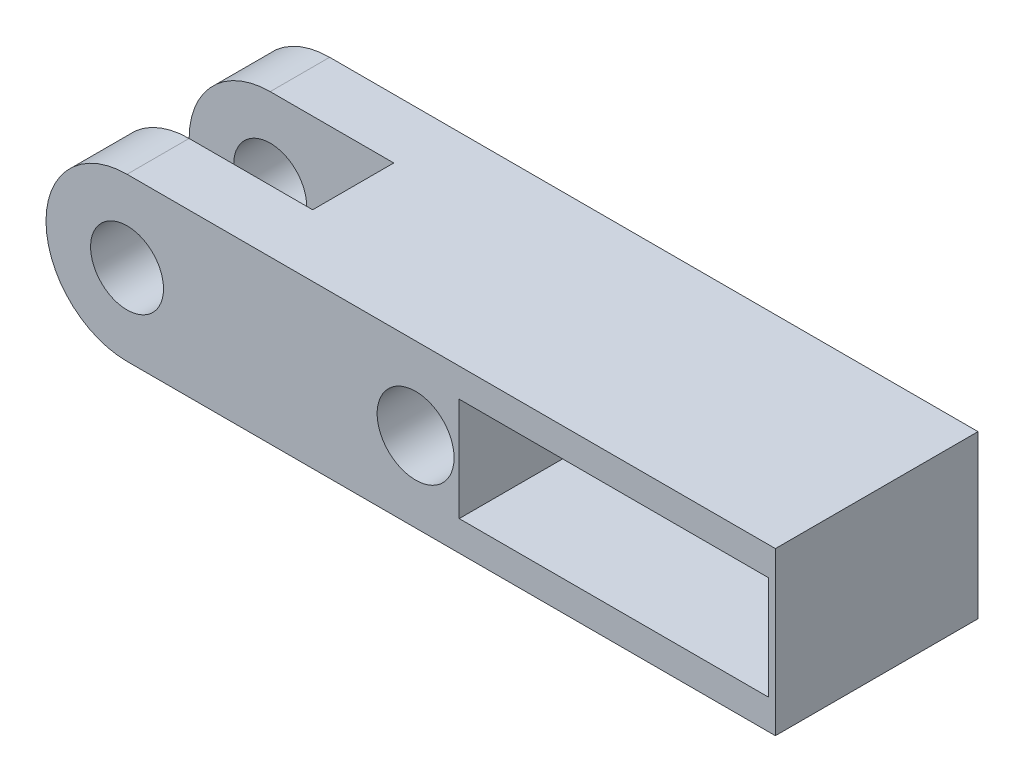
ISO-10303-21;
HEADER;
FILE_DESCRIPTION(('STEP AP214'),'2;1');
FILE_NAME('part.step','',(''),(''),'','','');
FILE_SCHEMA(('AUTOMOTIVE_DESIGN { 1 0 10303 214 1 1 1 1 }'));
ENDSEC;
DATA;
#1=APPLICATION_CONTEXT('core data for automotive mechanical design processes');
#2=APPLICATION_PROTOCOL_DEFINITION('international standard','automotive_design',2000,#1);
#3=PRODUCT_CONTEXT('',#1,'mechanical');
#4=PRODUCT('Part','Part','',(#3));
#5=PRODUCT_RELATED_PRODUCT_CATEGORY('part','',(#4));
#6=PRODUCT_DEFINITION_FORMATION('','',#4);
#7=PRODUCT_DEFINITION_CONTEXT('part definition',#1,'design');
#8=PRODUCT_DEFINITION('design','',#6,#7);
#9=PRODUCT_DEFINITION_SHAPE('','',#8);
#10=(LENGTH_UNIT() NAMED_UNIT(*) SI_UNIT(.MILLI.,.METRE.));
#11=(NAMED_UNIT(*) PLANE_ANGLE_UNIT() SI_UNIT($,.RADIAN.));
#12=(NAMED_UNIT(*) SI_UNIT($,.STERADIAN.) SOLID_ANGLE_UNIT());
#13=UNCERTAINTY_MEASURE_WITH_UNIT(LENGTH_MEASURE(1.E-05),#10,'distance_accuracy_value','');
#14=(GEOMETRIC_REPRESENTATION_CONTEXT(3) GLOBAL_UNCERTAINTY_ASSIGNED_CONTEXT((#13)) GLOBAL_UNIT_ASSIGNED_CONTEXT((#10,
#11,#12)) REPRESENTATION_CONTEXT('',''));
#15=CARTESIAN_POINT('',(0.,0.,0.));
#16=DIRECTION('',(0.,0.,1.));
#17=DIRECTION('',(1.,0.,0.));
#18=AXIS2_PLACEMENT_3D('',#15,#16,#17);
#19=CARTESIAN_POINT('',(0.,0.,6.25));
#20=DIRECTION('',(0.,0.,-1.));
#21=DIRECTION('',(-1.,0.,0.));
#22=AXIS2_PLACEMENT_3D('',#19,#20,#21);
#23=CYLINDRICAL_SURFACE('',#22,5.);
#24=DIRECTION('',(0.,0.,-1.));
#25=VECTOR('',#24,1.);
#26=CARTESIAN_POINT('',(0.,5.,6.25));
#27=LINE('',#26,#25);
#28=CARTESIAN_POINT('',(0.,5.,6.25));
#29=VERTEX_POINT('',#28);
#30=CARTESIAN_POINT('',(0.,5.,2.42259263310718));
#31=VERTEX_POINT('',#30);
#32=EDGE_CURVE('E264',#29,#31,#27,.T.);
#33=ORIENTED_EDGE('',*,*,#32,.T.);
#34=CARTESIAN_POINT('',(0.,0.,2.42259263310718));
#35=DIRECTION('',(0.,0.,1.));
#36=DIRECTION('',(1.,0.,0.));
#37=AXIS2_PLACEMENT_3D('',#34,#35,#36);
#38=CIRCLE('',#37,5.);
#39=CARTESIAN_POINT('',(0.,-5.,2.42259263310718));
#40=VERTEX_POINT('',#39);
#41=EDGE_CURVE('E170',#31,#40,#38,.T.);
#42=ORIENTED_EDGE('',*,*,#41,.T.);
#43=DIRECTION('',(0.,0.,-1.));
#44=VECTOR('',#43,1.);
#45=CARTESIAN_POINT('',(0.,-5.,6.25));
#46=LINE('',#45,#44);
#47=CARTESIAN_POINT('',(0.,-5.,6.25));
#48=VERTEX_POINT('',#47);
#49=EDGE_CURVE('E261',#48,#40,#46,.T.);
#50=ORIENTED_EDGE('',*,*,#49,.F.);
#51=CARTESIAN_POINT('',(0.,0.,6.25));
#52=DIRECTION('',(0.,0.,1.));
#53=DIRECTION('',(1.,0.,0.));
#54=AXIS2_PLACEMENT_3D('',#51,#52,#53);
#55=CIRCLE('',#54,5.);
#56=EDGE_CURVE('E203',#29,#48,#55,.T.);
#57=ORIENTED_EDGE('',*,*,#56,.F.);
#58=EDGE_LOOP('',(#33,#42,#50,#57));
#59=FACE_BOUND('',#58,.T.);
#60=ADVANCED_FACE('F49',(#59),#23,.T.);
#61=CARTESIAN_POINT('',(4.5553838479151E-12,-1.13936637902157E-10,6.25));
#62=DIRECTION('',(0.,0.,-1.));
#63=DIRECTION('',(-1.,0.,0.));
#64=AXIS2_PLACEMENT_3D('',#61,#62,#63);
#65=CYLINDRICAL_SURFACE('',#64,2.25000000000002);
#66=CARTESIAN_POINT('',(4.5553838479151E-12,-1.13936637902157E-10,2.42259263310718));
#67=DIRECTION('',(0.,0.,1.));
#68=DIRECTION('',(1.,0.,0.));
#69=AXIS2_PLACEMENT_3D('',#66,#67,#68);
#70=CIRCLE('',#69,2.25000000000002);
#71=CARTESIAN_POINT('',(2.25000000000457,-1.13936637902157E-10,2.42259263310718));
#72=VERTEX_POINT('',#71);
#73=EDGE_CURVE('E169',#72,#72,#70,.T.);
#74=ORIENTED_EDGE('',*,*,#73,.F.);
#75=EDGE_LOOP('',(#74));
#76=FACE_BOUND('',#75,.T.);
#77=CARTESIAN_POINT('',(4.5553838479151E-12,-1.13936637902157E-10,6.25));
#78=DIRECTION('',(0.,0.,1.));
#79=DIRECTION('',(1.,0.,0.));
#80=AXIS2_PLACEMENT_3D('',#77,#78,#79);
#81=CIRCLE('',#80,2.25000000000002);
#82=CARTESIAN_POINT('',(2.25000000000457,-1.13936637902157E-10,6.25));
#83=VERTEX_POINT('',#82);
#84=EDGE_CURVE('E179',#83,#83,#81,.T.);
#85=ORIENTED_EDGE('',*,*,#84,.T.);
#86=EDGE_LOOP('',(#85));
#87=FACE_BOUND('',#86,.T.);
#88=ADVANCED_FACE('F312',(#76,#87),#65,.F.);
#89=CARTESIAN_POINT('',(0.,5.,6.25));
#90=DIRECTION('',(0.,1.,0.));
#91=DIRECTION('',(0.,0.,1.));
#92=AXIS2_PLACEMENT_3D('',#89,#90,#91);
#93=PLANE('',#92);
#94=DIRECTION('',(-1.,0.,0.));
#95=VECTOR('',#94,1.);
#96=CARTESIAN_POINT('',(-5.24370745413475,5.,2.42259263310718));
#97=LINE('',#96,#95);
#98=CARTESIAN_POINT('',(7.62383381146094,5.,2.42259263310718));
#99=VERTEX_POINT('',#98);
#100=EDGE_CURVE('E156',#99,#31,#97,.T.);
#101=ORIENTED_EDGE('',*,*,#100,.T.);
#102=ORIENTED_EDGE('',*,*,#32,.F.);
#103=DIRECTION('',(1.,0.,0.));
#104=VECTOR('',#103,1.);
#105=CARTESIAN_POINT('',(0.,5.,6.25));
#106=LINE('',#105,#104);
#107=CARTESIAN_POINT('',(40.,5.,6.25));
#108=VERTEX_POINT('',#107);
#109=EDGE_CURVE('E199',#29,#108,#106,.T.);
#110=ORIENTED_EDGE('',*,*,#109,.T.);
#111=DIRECTION('',(0.,0.,-1.));
#112=VECTOR('',#111,1.);
#113=CARTESIAN_POINT('',(40.,5.,6.25));
#114=LINE('',#113,#112);
#115=CARTESIAN_POINT('',(40.,5.,-6.25));
#116=VERTEX_POINT('',#115);
#117=EDGE_CURVE('E253',#108,#116,#114,.T.);
#118=ORIENTED_EDGE('',*,*,#117,.T.);
#119=DIRECTION('',(1.,0.,0.));
#120=VECTOR('',#119,1.);
#121=CARTESIAN_POINT('',(0.,5.,-6.25));
#122=LINE('',#121,#120);
#123=CARTESIAN_POINT('',(0.,5.,-6.25));
#124=VERTEX_POINT('',#123);
#125=EDGE_CURVE('E238',#124,#116,#122,.T.);
#126=ORIENTED_EDGE('',*,*,#125,.F.);
#127=CARTESIAN_POINT('',(0.,5.,-2.58145119240226));
#128=VERTEX_POINT('',#127);
#129=EDGE_CURVE('E151',#128,#124,#27,.T.);
#130=ORIENTED_EDGE('',*,*,#129,.F.);
#131=DIRECTION('',(1.,0.,0.));
#132=VECTOR('',#131,1.);
#133=CARTESIAN_POINT('',(-5.24370745413475,5.,-2.58145119240226));
#134=LINE('',#133,#132);
#135=CARTESIAN_POINT('',(7.62383381146094,5.,-2.58145119240226));
#136=VERTEX_POINT('',#135);
#137=EDGE_CURVE('E139',#128,#136,#134,.T.);
#138=ORIENTED_EDGE('',*,*,#137,.T.);
#139=DIRECTION('',(0.,0.,1.));
#140=VECTOR('',#139,1.);
#141=CARTESIAN_POINT('',(7.62383381146094,5.,-2.58145119240226));
#142=LINE('',#141,#140);
#143=EDGE_CURVE('E149',#136,#99,#142,.T.);
#144=ORIENTED_EDGE('',*,*,#143,.T.);
#145=EDGE_LOOP('',(#101,#102,#110,#118,#126,#130,#138,#144));
#146=FACE_BOUND('',#145,.T.);
#147=ADVANCED_FACE('F148',(#146),#93,.T.);
#148=CARTESIAN_POINT('',(0.,-5.,-2.58145119240226));
#149=VERTEX_POINT('',#148);
#150=CARTESIAN_POINT('',(0.,-5.,-6.25));
#151=VERTEX_POINT('',#150);
#152=EDGE_CURVE('E260',#149,#151,#46,.T.);
#153=ORIENTED_EDGE('',*,*,#152,.F.);
#154=CARTESIAN_POINT('',(0.,0.,-2.58145119240226));
#155=DIRECTION('',(0.,0.,-1.));
#156=DIRECTION('',(-1.,0.,0.));
#157=AXIS2_PLACEMENT_3D('',#154,#155,#156);
#158=CIRCLE('',#157,5.);
#159=EDGE_CURVE('E166',#149,#128,#158,.T.);
#160=ORIENTED_EDGE('',*,*,#159,.T.);
#161=ORIENTED_EDGE('',*,*,#129,.T.);
#162=CARTESIAN_POINT('',(0.,0.,-6.25));
#163=DIRECTION('',(0.,0.,1.));
#164=DIRECTION('',(1.,0.,0.));
#165=AXIS2_PLACEMENT_3D('',#162,#163,#164);
#166=CIRCLE('',#165,5.);
#167=EDGE_CURVE('E242',#124,#151,#166,.T.);
#168=ORIENTED_EDGE('',*,*,#167,.T.);
#169=EDGE_LOOP('',(#153,#160,#161,#168));
#170=FACE_BOUND('',#169,.T.);
#171=ADVANCED_FACE('F294',(#170),#23,.T.);
#172=CARTESIAN_POINT('',(0.,-5.,6.25));
#173=DIRECTION('',(0.,1.,0.));
#174=DIRECTION('',(0.,0.,1.));
#175=AXIS2_PLACEMENT_3D('',#172,#173,#174);
#176=PLANE('',#175);
#177=DIRECTION('',(-1.,0.,0.));
#178=VECTOR('',#177,1.);
#179=CARTESIAN_POINT('',(-5.24370745413475,-5.,2.42259263310718));
#180=LINE('',#179,#178);
#181=CARTESIAN_POINT('',(17.623833811461,-5.,2.42259263310718));
#182=VERTEX_POINT('',#181);
#183=EDGE_CURVE('E66',#182,#40,#180,.T.);
#184=ORIENTED_EDGE('',*,*,#183,.F.);
#185=DIRECTION('',(0.,0.,-1.));
#186=VECTOR('',#185,1.);
#187=CARTESIAN_POINT('',(17.623833811461,-5.,6.25));
#188=LINE('',#187,#186);
#189=CARTESIAN_POINT('',(17.623833811461,-5.,-2.58145119240226));
#190=VERTEX_POINT('',#189);
#191=EDGE_CURVE('E268',#182,#190,#188,.T.);
#192=ORIENTED_EDGE('',*,*,#191,.T.);
#193=DIRECTION('',(1.,0.,0.));
#194=VECTOR('',#193,1.);
#195=CARTESIAN_POINT('',(-5.24370745413475,-5.,-2.58145119240226));
#196=LINE('',#195,#194);
#197=EDGE_CURVE('E73',#149,#190,#196,.T.);
#198=ORIENTED_EDGE('',*,*,#197,.F.);
#199=ORIENTED_EDGE('',*,*,#152,.T.);
#200=DIRECTION('',(1.,0.,0.));
#201=VECTOR('',#200,1.);
#202=CARTESIAN_POINT('',(0.,-5.,-6.25));
#203=LINE('',#202,#201);
#204=CARTESIAN_POINT('',(40.,-5.,-6.25));
#205=VERTEX_POINT('',#204);
#206=EDGE_CURVE('E246',#151,#205,#203,.T.);
#207=ORIENTED_EDGE('',*,*,#206,.T.);
#208=DIRECTION('',(0.,0.,-1.));
#209=VECTOR('',#208,1.);
#210=CARTESIAN_POINT('',(40.,-5.,6.25));
#211=LINE('',#210,#209);
#212=CARTESIAN_POINT('',(40.,-5.,6.25));
#213=VERTEX_POINT('',#212);
#214=EDGE_CURVE('E256',#213,#205,#211,.T.);
#215=ORIENTED_EDGE('',*,*,#214,.F.);
#216=DIRECTION('',(1.,0.,0.));
#217=VECTOR('',#216,1.);
#218=CARTESIAN_POINT('',(0.,-5.,6.25));
#219=LINE('',#218,#217);
#220=EDGE_CURVE('E207',#48,#213,#219,.T.);
#221=ORIENTED_EDGE('',*,*,#220,.F.);
#222=ORIENTED_EDGE('',*,*,#49,.T.);
#223=EDGE_LOOP('',(#184,#192,#198,#199,#207,#215,#221,#222));
#224=FACE_BOUND('',#223,.T.);
#225=ADVANCED_FACE('F290',(#224),#176,.F.);
#226=CARTESIAN_POINT('',(0.,3.22922335634601,6.25));
#227=DIRECTION('',(0.,1.,0.));
#228=DIRECTION('',(0.,0.,1.));
#229=AXIS2_PLACEMENT_3D('',#226,#227,#228);
#230=PLANE('',#229);
#231=DIRECTION('',(1.,0.,0.));
#232=VECTOR('',#231,1.);
#233=CARTESIAN_POINT('',(0.,3.22922335634601,-6.25));
#234=LINE('',#233,#232);
#235=CARTESIAN_POINT('',(20.493910385348,3.22922335634601,-6.25));
#236=VERTEX_POINT('',#235);
#237=CARTESIAN_POINT('',(39.573910385348,3.22922335634601,-6.25));
#238=VERTEX_POINT('',#237);
#239=EDGE_CURVE('E222',#236,#238,#234,.T.);
#240=ORIENTED_EDGE('',*,*,#239,.T.);
#241=DIRECTION('',(0.,0.,-1.));
#242=VECTOR('',#241,1.);
#243=CARTESIAN_POINT('',(39.573910385348,3.22922335634601,6.25));
#244=LINE('',#243,#242);
#245=CARTESIAN_POINT('',(39.573910385348,3.22922335634601,6.25));
#246=VERTEX_POINT('',#245);
#247=EDGE_CURVE('E257',#246,#238,#244,.T.);
#248=ORIENTED_EDGE('',*,*,#247,.F.);
#249=DIRECTION('',(1.,0.,0.));
#250=VECTOR('',#249,1.);
#251=CARTESIAN_POINT('',(0.,3.22922335634601,6.25));
#252=LINE('',#251,#250);
#253=CARTESIAN_POINT('',(20.493910385348,3.22922335634601,6.25));
#254=VERTEX_POINT('',#253);
#255=EDGE_CURVE('E184',#254,#246,#252,.T.);
#256=ORIENTED_EDGE('',*,*,#255,.F.);
#257=DIRECTION('',(0.,0.,-1.));
#258=VECTOR('',#257,1.);
#259=CARTESIAN_POINT('',(20.493910385348,3.22922335634601,6.25));
#260=LINE('',#259,#258);
#261=EDGE_CURVE('E214',#254,#236,#260,.T.);
#262=ORIENTED_EDGE('',*,*,#261,.T.);
#263=EDGE_LOOP('',(#240,#248,#256,#262));
#264=FACE_BOUND('',#263,.T.);
#265=ADVANCED_FACE('F328',(#264),#230,.F.);
#266=CARTESIAN_POINT('',(39.573910385348,0.,6.25));
#267=DIRECTION('',(1.,0.,0.));
#268=DIRECTION('',(0.,0.,-1.));
#269=AXIS2_PLACEMENT_3D('',#266,#267,#268);
#270=PLANE('',#269);
#271=DIRECTION('',(0.,-1.,0.));
#272=VECTOR('',#271,1.);
#273=CARTESIAN_POINT('',(39.573910385348,0.,-6.25));
#274=LINE('',#273,#272);
#275=CARTESIAN_POINT('',(39.573910385348,-3.15077664365399,-6.25));
#276=VERTEX_POINT('',#275);
#277=EDGE_CURVE('E226',#238,#276,#274,.T.);
#278=ORIENTED_EDGE('',*,*,#277,.T.);
#279=DIRECTION('',(0.,0.,-1.));
#280=VECTOR('',#279,1.);
#281=CARTESIAN_POINT('',(39.573910385348,-3.15077664365399,6.25));
#282=LINE('',#281,#280);
#283=CARTESIAN_POINT('',(39.573910385348,-3.15077664365399,6.25));
#284=VERTEX_POINT('',#283);
#285=EDGE_CURVE('E274',#284,#276,#282,.T.);
#286=ORIENTED_EDGE('',*,*,#285,.F.);
#287=DIRECTION('',(0.,-1.,0.));
#288=VECTOR('',#287,1.);
#289=CARTESIAN_POINT('',(39.573910385348,0.,6.25));
#290=LINE('',#289,#288);
#291=EDGE_CURVE('E188',#246,#284,#290,.T.);
#292=ORIENTED_EDGE('',*,*,#291,.F.);
#293=ORIENTED_EDGE('',*,*,#247,.T.);
#294=EDGE_LOOP('',(#278,#286,#292,#293));
#295=FACE_BOUND('',#294,.T.);
#296=ADVANCED_FACE('F340',(#295),#270,.F.);
#297=CARTESIAN_POINT('',(0.,-3.15077664365399,6.25));
#298=DIRECTION('',(0.,1.,0.));
#299=DIRECTION('',(0.,0.,1.));
#300=AXIS2_PLACEMENT_3D('',#297,#298,#299);
#301=PLANE('',#300);
#302=DIRECTION('',(1.,0.,0.));
#303=VECTOR('',#302,1.);
#304=CARTESIAN_POINT('',(0.,-3.15077664365399,-6.25));
#305=LINE('',#304,#303);
#306=CARTESIAN_POINT('',(20.493910385348,-3.15077664365399,-6.25));
#307=VERTEX_POINT('',#306);
#308=EDGE_CURVE('E230',#307,#276,#305,.T.);
#309=ORIENTED_EDGE('',*,*,#308,.F.);
#310=DIRECTION('',(0.,0.,-1.));
#311=VECTOR('',#310,1.);
#312=CARTESIAN_POINT('',(20.493910385348,-3.15077664365399,6.25));
#313=LINE('',#312,#311);
#314=CARTESIAN_POINT('',(20.493910385348,-3.15077664365399,6.25));
#315=VERTEX_POINT('',#314);
#316=EDGE_CURVE('E271',#315,#307,#313,.T.);
#317=ORIENTED_EDGE('',*,*,#316,.F.);
#318=DIRECTION('',(1.,0.,0.));
#319=VECTOR('',#318,1.);
#320=CARTESIAN_POINT('',(0.,-3.15077664365399,6.25));
#321=LINE('',#320,#319);
#322=EDGE_CURVE('E191',#315,#284,#321,.T.);
#323=ORIENTED_EDGE('',*,*,#322,.T.);
#324=ORIENTED_EDGE('',*,*,#285,.T.);
#325=EDGE_LOOP('',(#309,#317,#323,#324));
#326=FACE_BOUND('',#325,.T.);
#327=ADVANCED_FACE('F336',(#326),#301,.T.);
#328=CARTESIAN_POINT('',(20.493910385348,0.,6.25));
#329=DIRECTION('',(1.,0.,0.));
#330=DIRECTION('',(0.,0.,-1.));
#331=AXIS2_PLACEMENT_3D('',#328,#329,#330);
#332=PLANE('',#331);
#333=DIRECTION('',(0.,-1.,0.));
#334=VECTOR('',#333,1.);
#335=CARTESIAN_POINT('',(20.493910385348,0.,-6.25));
#336=LINE('',#335,#334);
#337=EDGE_CURVE('E234',#236,#307,#336,.T.);
#338=ORIENTED_EDGE('',*,*,#337,.F.);
#339=ORIENTED_EDGE('',*,*,#261,.F.);
#340=DIRECTION('',(0.,-1.,0.));
#341=VECTOR('',#340,1.);
#342=CARTESIAN_POINT('',(20.493910385348,0.,6.25));
#343=LINE('',#342,#341);
#344=EDGE_CURVE('E195',#254,#315,#343,.T.);
#345=ORIENTED_EDGE('',*,*,#344,.T.);
#346=ORIENTED_EDGE('',*,*,#316,.T.);
#347=EDGE_LOOP('',(#338,#339,#345,#346));
#348=FACE_BOUND('',#347,.T.);
#349=ADVANCED_FACE('F333',(#348),#332,.T.);
#350=CARTESIAN_POINT('',(4.5553838479151E-12,-1.13936637902157E-10,-2.58145119240226));
#351=DIRECTION('',(0.,0.,-1.));
#352=DIRECTION('',(-1.,0.,0.));
#353=AXIS2_PLACEMENT_3D('',#350,#351,#352);
#354=CIRCLE('',#353,2.25000000000002);
#355=CARTESIAN_POINT('',(-2.24999999999546,-1.13936637902157E-10,-2.58145119240226));
#356=VERTEX_POINT('',#355);
#357=EDGE_CURVE('E159',#356,#356,#354,.T.);
#358=ORIENTED_EDGE('',*,*,#357,.F.);
#359=EDGE_LOOP('',(#358));
#360=FACE_BOUND('',#359,.T.);
#361=CARTESIAN_POINT('',(4.5553838479151E-12,-1.13936637902157E-10,-6.25));
#362=DIRECTION('',(0.,0.,1.));
#363=DIRECTION('',(1.,0.,0.));
#364=AXIS2_PLACEMENT_3D('',#361,#362,#363);
#365=CIRCLE('',#364,2.25000000000002);
#366=CARTESIAN_POINT('',(2.25000000000457,-1.13936637902157E-10,-6.25));
#367=VERTEX_POINT('',#366);
#368=EDGE_CURVE('E218',#367,#367,#365,.T.);
#369=ORIENTED_EDGE('',*,*,#368,.F.);
#370=EDGE_LOOP('',(#369));
#371=FACE_BOUND('',#370,.T.);
#372=ADVANCED_FACE('F320',(#360,#371),#65,.F.);
#373=CARTESIAN_POINT('',(17.8029040337775,-0.0667958273800617,6.25));
#374=DIRECTION('',(0.,0.,-1.));
#375=DIRECTION('',(-1.,0.,0.));
#376=AXIS2_PLACEMENT_3D('',#373,#374,#375);
#377=CYLINDRICAL_SURFACE('',#376,2.37266457999999);
#378=CARTESIAN_POINT('',(17.8029040337775,-0.0667958273800617,6.25));
#379=DIRECTION('',(0.,0.,1.));
#380=DIRECTION('',(1.,0.,0.));
#381=AXIS2_PLACEMENT_3D('',#378,#379,#380);
#382=CIRCLE('',#381,2.37266457999999);
#383=CARTESIAN_POINT('',(20.1755686137775,-0.0667958273800617,6.25));
#384=VERTEX_POINT('',#383);
#385=EDGE_CURVE('E175',#384,#384,#382,.T.);
#386=ORIENTED_EDGE('',*,*,#385,.T.);
#387=EDGE_LOOP('',(#386));
#388=FACE_BOUND('',#387,.T.);
#389=CARTESIAN_POINT('',(17.8029040337775,-0.0667958273800617,-6.25));
#390=DIRECTION('',(0.,0.,1.));
#391=DIRECTION('',(1.,0.,0.));
#392=AXIS2_PLACEMENT_3D('',#389,#390,#391);
#393=CIRCLE('',#392,2.37266457999999);
#394=CARTESIAN_POINT('',(20.1755686137775,-0.0667958273800617,-6.25));
#395=VERTEX_POINT('',#394);
#396=EDGE_CURVE('E174',#395,#395,#393,.T.);
#397=ORIENTED_EDGE('',*,*,#396,.F.);
#398=EDGE_LOOP('',(#397));
#399=FACE_BOUND('',#398,.T.);
#400=ADVANCED_FACE('F347',(#388,#399),#377,.F.);
#401=CARTESIAN_POINT('',(40.,0.,6.25));
#402=DIRECTION('',(1.,0.,0.));
#403=DIRECTION('',(0.,0.,-1.));
#404=AXIS2_PLACEMENT_3D('',#401,#402,#403);
#405=PLANE('',#404);
#406=DIRECTION('',(0.,-1.,0.));
#407=VECTOR('',#406,1.);
#408=CARTESIAN_POINT('',(40.,0.,-6.25));
#409=LINE('',#408,#407);
#410=EDGE_CURVE('E180',#116,#205,#409,.T.);
#411=ORIENTED_EDGE('',*,*,#410,.F.);
#412=ORIENTED_EDGE('',*,*,#117,.F.);
#413=DIRECTION('',(0.,-1.,0.));
#414=VECTOR('',#413,1.);
#415=CARTESIAN_POINT('',(40.,0.,6.25));
#416=LINE('',#415,#414);
#417=EDGE_CURVE('E210',#108,#213,#416,.T.);
#418=ORIENTED_EDGE('',*,*,#417,.T.);
#419=ORIENTED_EDGE('',*,*,#214,.T.);
#420=EDGE_LOOP('',(#411,#412,#418,#419));
#421=FACE_BOUND('',#420,.T.);
#422=ADVANCED_FACE('F304',(#421),#405,.T.);
#423=CARTESIAN_POINT('',(0.,0.,6.25));
#424=DIRECTION('',(0.,0.,1.));
#425=DIRECTION('',(1.,0.,0.));
#426=AXIS2_PLACEMENT_3D('',#423,#424,#425);
#427=PLANE('',#426);
#428=ORIENTED_EDGE('',*,*,#385,.F.);
#429=EDGE_LOOP('',(#428));
#430=FACE_BOUND('',#429,.T.);
#431=ORIENTED_EDGE('',*,*,#84,.F.);
#432=EDGE_LOOP('',(#431));
#433=FACE_BOUND('',#432,.T.);
#434=ORIENTED_EDGE('',*,*,#255,.T.);
#435=ORIENTED_EDGE('',*,*,#291,.T.);
#436=ORIENTED_EDGE('',*,*,#322,.F.);
#437=ORIENTED_EDGE('',*,*,#344,.F.);
#438=EDGE_LOOP('',(#434,#435,#436,#437));
#439=FACE_BOUND('',#438,.T.);
#440=ORIENTED_EDGE('',*,*,#109,.F.);
#441=ORIENTED_EDGE('',*,*,#56,.T.);
#442=ORIENTED_EDGE('',*,*,#220,.T.);
#443=ORIENTED_EDGE('',*,*,#417,.F.);
#444=EDGE_LOOP('',(#440,#441,#442,#443));
#445=FACE_BOUND('',#444,.T.);
#446=ADVANCED_FACE('F309',(#430,#433,#439,#445),#427,.T.);
#447=CARTESIAN_POINT('',(0.,0.,-6.25));
#448=DIRECTION('',(0.,0.,1.));
#449=DIRECTION('',(1.,0.,0.));
#450=AXIS2_PLACEMENT_3D('',#447,#448,#449);
#451=PLANE('',#450);
#452=ORIENTED_EDGE('',*,*,#396,.T.);
#453=EDGE_LOOP('',(#452));
#454=FACE_BOUND('',#453,.T.);
#455=ORIENTED_EDGE('',*,*,#368,.T.);
#456=EDGE_LOOP('',(#455));
#457=FACE_BOUND('',#456,.T.);
#458=ORIENTED_EDGE('',*,*,#239,.F.);
#459=ORIENTED_EDGE('',*,*,#337,.T.);
#460=ORIENTED_EDGE('',*,*,#308,.T.);
#461=ORIENTED_EDGE('',*,*,#277,.F.);
#462=EDGE_LOOP('',(#458,#459,#460,#461));
#463=FACE_BOUND('',#462,.T.);
#464=ORIENTED_EDGE('',*,*,#125,.T.);
#465=ORIENTED_EDGE('',*,*,#410,.T.);
#466=ORIENTED_EDGE('',*,*,#206,.F.);
#467=ORIENTED_EDGE('',*,*,#167,.F.);
#468=EDGE_LOOP('',(#464,#465,#466,#467));
#469=FACE_BOUND('',#468,.T.);
#470=ADVANCED_FACE('F299',(#454,#457,#463,#469),#451,.F.);
#471=CARTESIAN_POINT('',(-5.24370745413475,5.,2.42259263310718));
#472=DIRECTION('',(0.,0.,1.));
#473=DIRECTION('',(1.,0.,0.));
#474=AXIS2_PLACEMENT_3D('',#471,#472,#473);
#475=PLANE('',#474);
#476=ORIENTED_EDGE('',*,*,#73,.T.);
#477=EDGE_LOOP('',(#476));
#478=FACE_BOUND('',#477,.T.);
#479=ORIENTED_EDGE('',*,*,#100,.F.);
#480=DIRECTION('',(-0.707106781186549,0.707106781186546,0.));
#481=VECTOR('',#480,1.);
#482=CARTESIAN_POINT('',(1.19006317866307,11.4337706327978,2.42259263310718));
#483=LINE('',#482,#481);
#484=EDGE_CURVE('E59',#99,#182,#483,.F.);
#485=ORIENTED_EDGE('',*,*,#484,.T.);
#486=ORIENTED_EDGE('',*,*,#183,.T.);
#487=ORIENTED_EDGE('',*,*,#41,.F.);
#488=EDGE_LOOP('',(#479,#485,#486,#487));
#489=FACE_BOUND('',#488,.T.);
#490=ADVANCED_FACE('F289',(#478,#489),#475,.F.);
#491=CARTESIAN_POINT('',(-5.24370745413475,5.,-2.58145119240226));
#492=DIRECTION('',(0.,0.,-1.));
#493=DIRECTION('',(-1.,0.,0.));
#494=AXIS2_PLACEMENT_3D('',#491,#492,#493);
#495=PLANE('',#494);
#496=ORIENTED_EDGE('',*,*,#357,.T.);
#497=EDGE_LOOP('',(#496));
#498=FACE_BOUND('',#497,.T.);
#499=ORIENTED_EDGE('',*,*,#197,.T.);
#500=DIRECTION('',(0.707106781186549,-0.707106781186546,0.));
#501=VECTOR('',#500,1.);
#502=CARTESIAN_POINT('',(1.19006317866307,11.4337706327978,-2.58145119240226));
#503=LINE('',#502,#501);
#504=EDGE_CURVE('E11',#190,#136,#503,.F.);
#505=ORIENTED_EDGE('',*,*,#504,.T.);
#506=ORIENTED_EDGE('',*,*,#137,.F.);
#507=ORIENTED_EDGE('',*,*,#159,.F.);
#508=EDGE_LOOP('',(#499,#505,#506,#507));
#509=FACE_BOUND('',#508,.T.);
#510=ADVANCED_FACE('F138',(#498,#509),#495,.F.);
#511=CARTESIAN_POINT('',(7.62383381146094,4.99999999999999,-2.58145119240226));
#512=DIRECTION('',(0.707106781186546,0.707106781186549,0.));
#513=DIRECTION('',(0.,0.,1.));
#514=AXIS2_PLACEMENT_3D('',#511,#512,#513);
#515=PLANE('',#514);
#516=ORIENTED_EDGE('',*,*,#504,.F.);
#517=ORIENTED_EDGE('',*,*,#191,.F.);
#518=ORIENTED_EDGE('',*,*,#484,.F.);
#519=ORIENTED_EDGE('',*,*,#143,.F.);
#520=EDGE_LOOP('',(#516,#517,#518,#519));
#521=FACE_BOUND('',#520,.T.);
#522=ADVANCED_FACE('F52',(#521),#515,.F.);
#523=CLOSED_SHELL('',(#60,#88,#147,#171,#225,#265,#296,#327,#349,#372,#400,#422,#446,#470,#490,
#510,#522));
#524=MANIFOLD_SOLID_BREP('B2',#523);
#525=ADVANCED_BREP_SHAPE_REPRESENTATION('',(#18,#524),#14);
#526=SHAPE_DEFINITION_REPRESENTATION(#9,#525);
ENDSEC;
END-ISO-10303-21;
